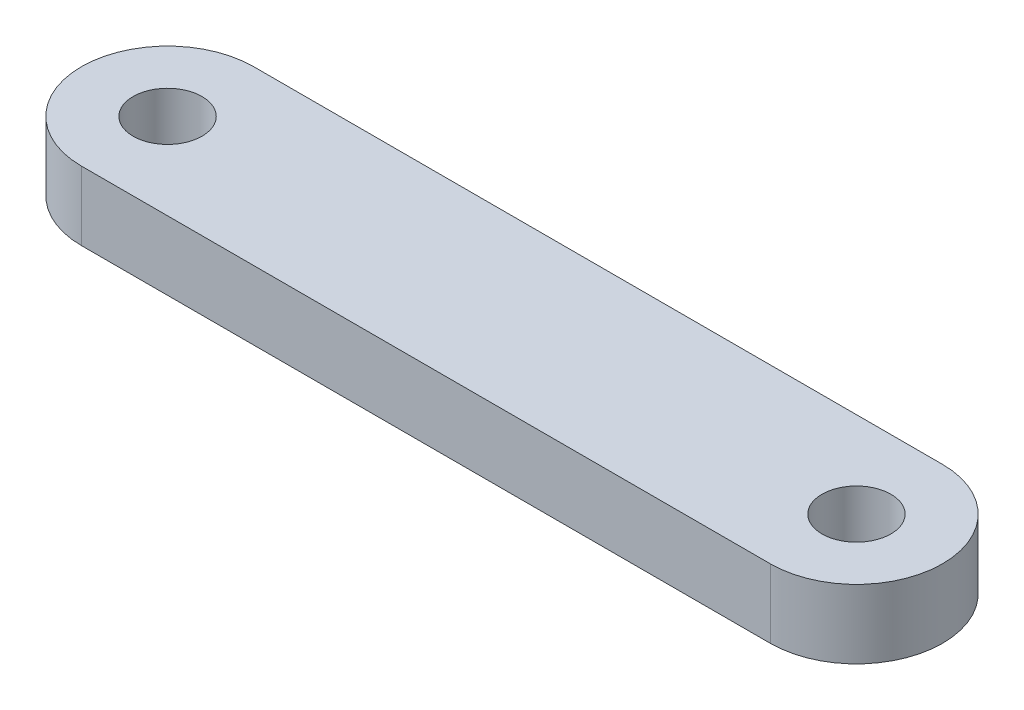
ISO-10303-21;
HEADER;
FILE_DESCRIPTION(('STEP AP214'),'2;1');
FILE_NAME('part.step','',(''),(''),'','','');
FILE_SCHEMA(('AUTOMOTIVE_DESIGN { 1 0 10303 214 1 1 1 1 }'));
ENDSEC;
DATA;
#1=APPLICATION_CONTEXT('core data for automotive mechanical design processes');
#2=APPLICATION_PROTOCOL_DEFINITION('international standard','automotive_design',2000,#1);
#3=PRODUCT_CONTEXT('',#1,'mechanical');
#4=PRODUCT('Part','Part','',(#3));
#5=PRODUCT_RELATED_PRODUCT_CATEGORY('part','',(#4));
#6=PRODUCT_DEFINITION_FORMATION('','',#4);
#7=PRODUCT_DEFINITION_CONTEXT('part definition',#1,'design');
#8=PRODUCT_DEFINITION('design','',#6,#7);
#9=PRODUCT_DEFINITION_SHAPE('','',#8);
#10=(LENGTH_UNIT() NAMED_UNIT(*) SI_UNIT(.MILLI.,.METRE.));
#11=(NAMED_UNIT(*) PLANE_ANGLE_UNIT() SI_UNIT($,.RADIAN.));
#12=(NAMED_UNIT(*) SI_UNIT($,.STERADIAN.) SOLID_ANGLE_UNIT());
#13=UNCERTAINTY_MEASURE_WITH_UNIT(LENGTH_MEASURE(1.E-05),#10,'distance_accuracy_value','');
#14=(GEOMETRIC_REPRESENTATION_CONTEXT(3) GLOBAL_UNCERTAINTY_ASSIGNED_CONTEXT((#13)) GLOBAL_UNIT_ASSIGNED_CONTEXT((#10,
#11,#12)) REPRESENTATION_CONTEXT('',''));
#15=CARTESIAN_POINT('',(0.,0.,0.));
#16=DIRECTION('',(0.,0.,1.));
#17=DIRECTION('',(1.,0.,0.));
#18=AXIS2_PLACEMENT_3D('',#15,#16,#17);
#19=CARTESIAN_POINT('',(0.,2.,0.));
#20=DIRECTION('',(0.,1.,0.));
#21=DIRECTION('',(0.,0.,1.));
#22=AXIS2_PLACEMENT_3D('',#19,#20,#21);
#23=PLANE('',#22);
#24=CARTESIAN_POINT('',(0.,2.,0.));
#25=DIRECTION('',(0.,1.,0.));
#26=DIRECTION('',(0.,0.,1.));
#27=AXIS2_PLACEMENT_3D('',#24,#25,#26);
#28=CIRCLE('',#27,1.);
#29=CARTESIAN_POINT('',(0.,2.,1.));
#30=VERTEX_POINT('',#29);
#31=EDGE_CURVE('E104',#30,#30,#28,.T.);
#32=ORIENTED_EDGE('',*,*,#31,.F.);
#33=EDGE_LOOP('',(#32));
#34=FACE_BOUND('',#33,.T.);
#35=CARTESIAN_POINT('',(0.,2.,0.));
#36=DIRECTION('',(0.,1.,0.));
#37=DIRECTION('',(0.,0.,1.));
#38=AXIS2_PLACEMENT_3D('',#35,#36,#37);
#39=CIRCLE('',#38,2.5);
#40=CARTESIAN_POINT('',(0.,2.,-2.5));
#41=VERTEX_POINT('',#40);
#42=CARTESIAN_POINT('',(0.,2.,2.5));
#43=VERTEX_POINT('',#42);
#44=EDGE_CURVE('E89',#41,#43,#39,.T.);
#45=ORIENTED_EDGE('',*,*,#44,.T.);
#46=DIRECTION('',(1.,0.,0.));
#47=VECTOR('',#46,1.);
#48=CARTESIAN_POINT('',(0.,2.,2.5));
#49=LINE('',#48,#47);
#50=CARTESIAN_POINT('',(20.,2.,2.5));
#51=VERTEX_POINT('',#50);
#52=EDGE_CURVE('E84',#43,#51,#49,.T.);
#53=ORIENTED_EDGE('',*,*,#52,.T.);
#54=CARTESIAN_POINT('',(20.,2.,0.));
#55=DIRECTION('',(0.,1.,0.));
#56=DIRECTION('',(0.,0.,1.));
#57=AXIS2_PLACEMENT_3D('',#54,#55,#56);
#58=CIRCLE('',#57,2.5);
#59=CARTESIAN_POINT('',(20.,2.,-2.5));
#60=VERTEX_POINT('',#59);
#61=EDGE_CURVE('E87',#51,#60,#58,.T.);
#62=ORIENTED_EDGE('',*,*,#61,.T.);
#63=DIRECTION('',(-1.,0.,0.));
#64=VECTOR('',#63,1.);
#65=CARTESIAN_POINT('',(0.,2.,-2.5));
#66=LINE('',#65,#64);
#67=EDGE_CURVE('E54',#60,#41,#66,.T.);
#68=ORIENTED_EDGE('',*,*,#67,.T.);
#69=EDGE_LOOP('',(#45,#53,#62,#68));
#70=FACE_BOUND('',#69,.T.);
#71=CARTESIAN_POINT('',(20.,2.,0.));
#72=DIRECTION('',(0.,1.,0.));
#73=DIRECTION('',(0.,0.,1.));
#74=AXIS2_PLACEMENT_3D('',#71,#72,#73);
#75=CIRCLE('',#74,1.);
#76=CARTESIAN_POINT('',(20.,2.,1.));
#77=VERTEX_POINT('',#76);
#78=EDGE_CURVE('E119',#77,#77,#75,.T.);
#79=ORIENTED_EDGE('',*,*,#78,.F.);
#80=EDGE_LOOP('',(#79));
#81=FACE_BOUND('',#80,.T.);
#82=ADVANCED_FACE('F37',(#34,#70,#81),#23,.T.);
#83=CARTESIAN_POINT('',(0.,0.,0.));
#84=DIRECTION('',(0.,1.,0.));
#85=DIRECTION('',(0.,0.,1.));
#86=AXIS2_PLACEMENT_3D('',#83,#84,#85);
#87=PLANE('',#86);
#88=CARTESIAN_POINT('',(0.,0.,0.));
#89=DIRECTION('',(0.,1.,0.));
#90=DIRECTION('',(0.,0.,1.));
#91=AXIS2_PLACEMENT_3D('',#88,#89,#90);
#92=CIRCLE('',#91,2.5);
#93=CARTESIAN_POINT('',(0.,0.,-2.5));
#94=VERTEX_POINT('',#93);
#95=CARTESIAN_POINT('',(0.,0.,2.5));
#96=VERTEX_POINT('',#95);
#97=EDGE_CURVE('E101',#94,#96,#92,.T.);
#98=ORIENTED_EDGE('',*,*,#97,.F.);
#99=DIRECTION('',(-1.,0.,0.));
#100=VECTOR('',#99,1.);
#101=CARTESIAN_POINT('',(0.,0.,-2.5));
#102=LINE('',#101,#100);
#103=CARTESIAN_POINT('',(20.,0.,-2.5));
#104=VERTEX_POINT('',#103);
#105=EDGE_CURVE('E77',#104,#94,#102,.T.);
#106=ORIENTED_EDGE('',*,*,#105,.F.);
#107=CARTESIAN_POINT('',(20.,0.,0.));
#108=DIRECTION('',(0.,1.,0.));
#109=DIRECTION('',(0.,0.,1.));
#110=AXIS2_PLACEMENT_3D('',#107,#108,#109);
#111=CIRCLE('',#110,2.5);
#112=CARTESIAN_POINT('',(20.,0.,2.5));
#113=VERTEX_POINT('',#112);
#114=EDGE_CURVE('E71',#113,#104,#111,.T.);
#115=ORIENTED_EDGE('',*,*,#114,.F.);
#116=DIRECTION('',(1.,0.,0.));
#117=VECTOR('',#116,1.);
#118=CARTESIAN_POINT('',(0.,0.,2.5));
#119=LINE('',#118,#117);
#120=EDGE_CURVE('E93',#96,#113,#119,.T.);
#121=ORIENTED_EDGE('',*,*,#120,.F.);
#122=EDGE_LOOP('',(#98,#106,#115,#121));
#123=FACE_BOUND('',#122,.T.);
#124=CARTESIAN_POINT('',(0.,0.,0.));
#125=DIRECTION('',(0.,1.,0.));
#126=DIRECTION('',(0.,0.,1.));
#127=AXIS2_PLACEMENT_3D('',#124,#125,#126);
#128=CIRCLE('',#127,1.);
#129=CARTESIAN_POINT('',(0.,0.,1.));
#130=VERTEX_POINT('',#129);
#131=EDGE_CURVE('E116',#130,#130,#128,.T.);
#132=ORIENTED_EDGE('',*,*,#131,.T.);
#133=EDGE_LOOP('',(#132));
#134=FACE_BOUND('',#133,.T.);
#135=CARTESIAN_POINT('',(20.,0.,0.));
#136=DIRECTION('',(0.,1.,0.));
#137=DIRECTION('',(0.,0.,1.));
#138=AXIS2_PLACEMENT_3D('',#135,#136,#137);
#139=CIRCLE('',#138,1.);
#140=CARTESIAN_POINT('',(20.,0.,1.));
#141=VERTEX_POINT('',#140);
#142=EDGE_CURVE('E122',#141,#141,#139,.T.);
#143=ORIENTED_EDGE('',*,*,#142,.T.);
#144=EDGE_LOOP('',(#143));
#145=FACE_BOUND('',#144,.T.);
#146=ADVANCED_FACE('F112',(#123,#134,#145),#87,.F.);
#147=CARTESIAN_POINT('',(0.,2.,0.));
#148=DIRECTION('',(0.,-1.,0.));
#149=DIRECTION('',(0.,0.,-1.));
#150=AXIS2_PLACEMENT_3D('',#147,#148,#149);
#151=CYLINDRICAL_SURFACE('',#150,2.5);
#152=ORIENTED_EDGE('',*,*,#97,.T.);
#153=DIRECTION('',(0.,-1.,0.));
#154=VECTOR('',#153,1.);
#155=CARTESIAN_POINT('',(0.,2.,2.5));
#156=LINE('',#155,#154);
#157=EDGE_CURVE('E11',#43,#96,#156,.T.);
#158=ORIENTED_EDGE('',*,*,#157,.F.);
#159=ORIENTED_EDGE('',*,*,#44,.F.);
#160=DIRECTION('',(0.,-1.,0.));
#161=VECTOR('',#160,1.);
#162=CARTESIAN_POINT('',(0.,2.,-2.5));
#163=LINE('',#162,#161);
#164=EDGE_CURVE('E97',#41,#94,#163,.T.);
#165=ORIENTED_EDGE('',*,*,#164,.T.);
#166=EDGE_LOOP('',(#152,#158,#159,#165));
#167=FACE_BOUND('',#166,.T.);
#168=ADVANCED_FACE('F39',(#167),#151,.T.);
#169=CARTESIAN_POINT('',(0.,2.,2.5));
#170=DIRECTION('',(0.,0.,-1.));
#171=DIRECTION('',(-1.,0.,0.));
#172=AXIS2_PLACEMENT_3D('',#169,#170,#171);
#173=PLANE('',#172);
#174=ORIENTED_EDGE('',*,*,#120,.T.);
#175=DIRECTION('',(0.,-1.,0.));
#176=VECTOR('',#175,1.);
#177=CARTESIAN_POINT('',(20.,2.,2.5));
#178=LINE('',#177,#176);
#179=EDGE_CURVE('E46',#51,#113,#178,.T.);
#180=ORIENTED_EDGE('',*,*,#179,.F.);
#181=ORIENTED_EDGE('',*,*,#52,.F.);
#182=ORIENTED_EDGE('',*,*,#157,.T.);
#183=EDGE_LOOP('',(#174,#180,#181,#182));
#184=FACE_BOUND('',#183,.T.);
#185=ADVANCED_FACE('F92',(#184),#173,.F.);
#186=CARTESIAN_POINT('',(20.,2.,0.));
#187=DIRECTION('',(0.,-1.,0.));
#188=DIRECTION('',(0.,0.,-1.));
#189=AXIS2_PLACEMENT_3D('',#186,#187,#188);
#190=CYLINDRICAL_SURFACE('',#189,2.5);
#191=ORIENTED_EDGE('',*,*,#114,.T.);
#192=DIRECTION('',(0.,-1.,0.));
#193=VECTOR('',#192,1.);
#194=CARTESIAN_POINT('',(20.,2.,-2.5));
#195=LINE('',#194,#193);
#196=EDGE_CURVE('E94',#60,#104,#195,.T.);
#197=ORIENTED_EDGE('',*,*,#196,.F.);
#198=ORIENTED_EDGE('',*,*,#61,.F.);
#199=ORIENTED_EDGE('',*,*,#179,.T.);
#200=EDGE_LOOP('',(#191,#197,#198,#199));
#201=FACE_BOUND('',#200,.T.);
#202=ADVANCED_FACE('F95',(#201),#190,.T.);
#203=CARTESIAN_POINT('',(0.,2.,-2.5));
#204=DIRECTION('',(0.,0.,1.));
#205=DIRECTION('',(1.,0.,0.));
#206=AXIS2_PLACEMENT_3D('',#203,#204,#205);
#207=PLANE('',#206);
#208=ORIENTED_EDGE('',*,*,#105,.T.);
#209=ORIENTED_EDGE('',*,*,#164,.F.);
#210=ORIENTED_EDGE('',*,*,#67,.F.);
#211=ORIENTED_EDGE('',*,*,#196,.T.);
#212=EDGE_LOOP('',(#208,#209,#210,#211));
#213=FACE_BOUND('',#212,.T.);
#214=ADVANCED_FACE('F109',(#213),#207,.F.);
#215=CARTESIAN_POINT('',(0.,2.,0.));
#216=DIRECTION('',(0.,-1.,0.));
#217=DIRECTION('',(0.,0.,-1.));
#218=AXIS2_PLACEMENT_3D('',#215,#216,#217);
#219=CYLINDRICAL_SURFACE('',#218,1.);
#220=ORIENTED_EDGE('',*,*,#31,.T.);
#221=EDGE_LOOP('',(#220));
#222=FACE_BOUND('',#221,.T.);
#223=ORIENTED_EDGE('',*,*,#131,.F.);
#224=EDGE_LOOP('',(#223));
#225=FACE_BOUND('',#224,.T.);
#226=ADVANCED_FACE('F139',(#222,#225),#219,.F.);
#227=CARTESIAN_POINT('',(20.,2.,0.));
#228=DIRECTION('',(0.,-1.,0.));
#229=DIRECTION('',(0.,0.,-1.));
#230=AXIS2_PLACEMENT_3D('',#227,#228,#229);
#231=CYLINDRICAL_SURFACE('',#230,1.);
#232=ORIENTED_EDGE('',*,*,#78,.T.);
#233=EDGE_LOOP('',(#232));
#234=FACE_BOUND('',#233,.T.);
#235=ORIENTED_EDGE('',*,*,#142,.F.);
#236=EDGE_LOOP('',(#235));
#237=FACE_BOUND('',#236,.T.);
#238=ADVANCED_FACE('F128',(#234,#237),#231,.F.);
#239=CLOSED_SHELL('',(#82,#146,#168,#185,#202,#214,#226,#238));
#240=MANIFOLD_SOLID_BREP('B2',#239);
#241=ADVANCED_BREP_SHAPE_REPRESENTATION('',(#18,#240),#14);
#242=SHAPE_DEFINITION_REPRESENTATION(#9,#241);
ENDSEC;
END-ISO-10303-21;
